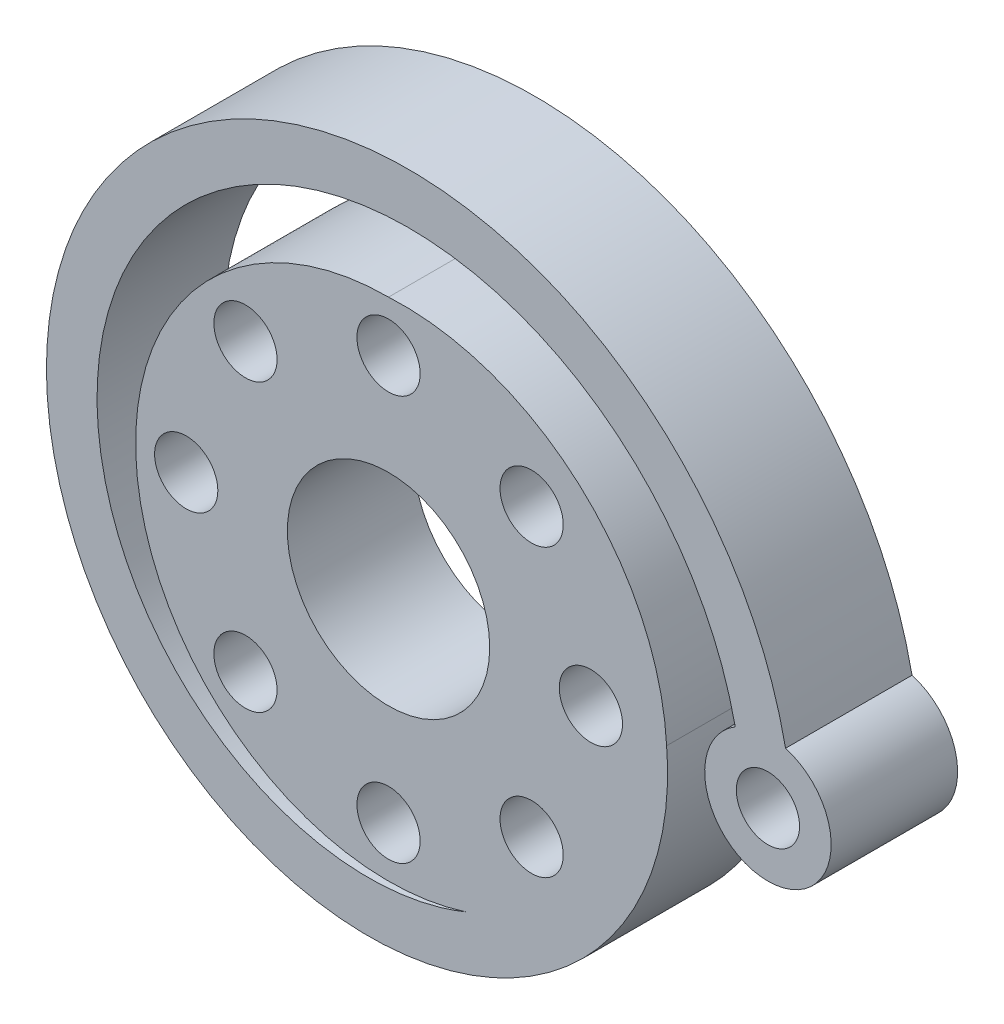
ISO-10303-21;
HEADER;
FILE_DESCRIPTION(('STEP AP214'),'2;1');
FILE_NAME('part.step','',(''),(''),'','','');
FILE_SCHEMA(('AUTOMOTIVE_DESIGN { 1 0 10303 214 1 1 1 1 }'));
ENDSEC;
DATA;
#1=APPLICATION_CONTEXT('core data for automotive mechanical design processes');
#2=APPLICATION_PROTOCOL_DEFINITION('international standard','automotive_design',2000,#1);
#3=PRODUCT_CONTEXT('',#1,'mechanical');
#4=PRODUCT('Part','Part','',(#3));
#5=PRODUCT_RELATED_PRODUCT_CATEGORY('part','',(#4));
#6=PRODUCT_DEFINITION_FORMATION('','',#4);
#7=PRODUCT_DEFINITION_CONTEXT('part definition',#1,'design');
#8=PRODUCT_DEFINITION('design','',#6,#7);
#9=PRODUCT_DEFINITION_SHAPE('','',#8);
#10=(LENGTH_UNIT() NAMED_UNIT(*) SI_UNIT(.MILLI.,.METRE.));
#11=(NAMED_UNIT(*) PLANE_ANGLE_UNIT() SI_UNIT($,.RADIAN.));
#12=(NAMED_UNIT(*) SI_UNIT($,.STERADIAN.) SOLID_ANGLE_UNIT());
#13=UNCERTAINTY_MEASURE_WITH_UNIT(LENGTH_MEASURE(1.E-05),#10,'distance_accuracy_value','');
#14=(GEOMETRIC_REPRESENTATION_CONTEXT(3) GLOBAL_UNCERTAINTY_ASSIGNED_CONTEXT((#13)) GLOBAL_UNIT_ASSIGNED_CONTEXT((#10,
#11,#12)) REPRESENTATION_CONTEXT('',''));
#15=CARTESIAN_POINT('',(0.,0.,0.));
#16=DIRECTION('',(0.,0.,1.));
#17=DIRECTION('',(1.,0.,0.));
#18=AXIS2_PLACEMENT_3D('',#15,#16,#17);
#19=CARTESIAN_POINT('',(0.,0.,2.5));
#20=DIRECTION('',(0.,0.,1.));
#21=DIRECTION('',(1.,0.,0.));
#22=AXIS2_PLACEMENT_3D('',#19,#20,#21);
#23=PLANE('',#22);
#24=CARTESIAN_POINT('',(15.,0.,2.5));
#25=DIRECTION('',(0.,0.,1.));
#26=DIRECTION('',(1.,0.,0.));
#27=AXIS2_PLACEMENT_3D('',#24,#25,#26);
#28=CIRCLE('',#27,1.25);
#29=CARTESIAN_POINT('',(16.25,0.,2.5));
#30=VERTEX_POINT('',#29);
#31=EDGE_CURVE('E228',#30,#30,#28,.T.);
#32=ORIENTED_EDGE('',*,*,#31,.F.);
#33=EDGE_LOOP('',(#32));
#34=FACE_BOUND('',#33,.T.);
#35=CARTESIAN_POINT('',(14.0014042751306,-0.0529771485877786,2.5));
#36=CARTESIAN_POINT('',(13.9041730455411,1.78019652095135,2.5));
#37=CARTESIAN_POINT('',(13.4425655873807,3.57209419642495,2.5));
#38=CARTESIAN_POINT('',(11.8908774959252,6.80923704342206,2.5));
#39=CARTESIAN_POINT('',(10.801709203525,8.25333290406653,2.5));
#40=CARTESIAN_POINT('',(8.18696613893286,10.5921890907236,2.5));
#41=CARTESIAN_POINT('',(6.66265131611176,11.4862596842162,2.5));
#42=CARTESIAN_POINT('',(3.42736791975972,12.614868216527,2.5));
#43=CARTESIAN_POINT('',(1.71779764208779,12.8492635131975,2.5));
#44=CARTESIAN_POINT('',(-1.62130253349248,12.6535629323774,2.5));
#45=CARTESIAN_POINT('',(-3.24951817725595,12.2238704914102,2.5));
#46=CARTESIAN_POINT('',(-6.18385048064188,10.7962704189784,2.5));
#47=CARTESIAN_POINT('',(-7.48893709981214,9.79922624606061,2.5));
#48=CARTESIAN_POINT('',(-9.5955192522989,7.41500614093897,2.5));
#49=CARTESIAN_POINT('',(-10.3964164266881,6.02899943999595,2.5));
#50=CARTESIAN_POINT('',(-11.3986490506443,3.09557891247944,2.5));
#51=CARTESIAN_POINT('',(-11.5998915588236,1.54944460153061,2.5));
#52=CARTESIAN_POINT('',(-11.4029527820651,-1.46240868151555,2.5));
#53=CARTESIAN_POINT('',(-11.0051753946417,-2.92694215777486,2.5));
#54=CARTESIAN_POINT('',(-9.70166334282952,-5.5584639181738,2.5));
#55=CARTESIAN_POINT('',(-8.79674328792216,-6.72454129491613,2.5));
#56=CARTESIAN_POINT('',(-6.64304614361916,-8.59884941451587,2.5));
#57=CARTESIAN_POINT('',(-5.39534756347179,-9.30657316823967,2.5));
#58=CARTESIAN_POINT('',(-2.76378990560753,-10.1824298856819,2.5));
#59=CARTESIAN_POINT('',(-1.38109156094889,-10.350519603358,2.5));
#60=CARTESIAN_POINT('',(1.30351482951407,-10.1523426328444,2.5));
#61=CARTESIAN_POINT('',(2.60436613786412,-9.78648029675871,2.5));
#62=CARTESIAN_POINT('',(4.93307735613537,-8.60705626779512,2.5));
#63=CARTESIAN_POINT('',(5.96014548912132,-7.79426032885127,2.5));
#64=CARTESIAN_POINT('',(7.60217957763164,-5.87108614723178,2.5));
#65=CARTESIAN_POINT('',(8.21672990849835,-4.76169568638045,2.5));
#66=CARTESIAN_POINT('',(8.96621072201242,-2.43200089930278,2.5));
#67=CARTESIAN_POINT('',(9.10114770430962,-1.21273865857678,2.5));
#68=CARTESIAN_POINT('',(9.00144006575811,-0.0340587714272848,2.5));
#69=B_SPLINE_CURVE_WITH_KNOTS('',3,(#35,#36,#37,#38,#39,#40,#41,#42,#43,#44,#45,#46,#47,#48,#49,
#50,#51,#52,#53,#54,#55,#56,#57,#58,#59,#60,#61,#62,#63,#64,#65,#66,#67,#68),.UNSPECIFIED.,.F.,
.F.,(4,2,2,2,2,2,2,2,2,2,2,2,2,2,2,2,4),(0.,0.0625,0.125,0.1875,0.25,0.3125,0.375,0.4375,0.5,
0.5625,0.625,0.6875,0.75,0.8125,0.875,0.9375,1.),.UNSPECIFIED.);
#70=CARTESIAN_POINT('',(13.7083307005809,2.14046500110098,2.5));
#71=VERTEX_POINT('',#70);
#72=CARTESIAN_POINT('',(3.06907607613109,-9.517393132519,2.5));
#73=VERTEX_POINT('',#72);
#74=EDGE_CURVE('E71',#71,#73,#69,.T.);
#75=ORIENTED_EDGE('',*,*,#74,.F.);
#76=CARTESIAN_POINT('',(15.,0.,2.5));
#77=DIRECTION('',(0.,0.,1.));
#78=DIRECTION('',(1.,0.,0.));
#79=AXIS2_PLACEMENT_3D('',#76,#77,#78);
#80=CIRCLE('',#79,2.5);
#81=CARTESIAN_POINT('',(15.6976438073508,2.40068596823183,2.5));
#82=VERTEX_POINT('',#81);
#83=EDGE_CURVE('E64',#71,#82,#80,.T.);
#84=ORIENTED_EDGE('',*,*,#83,.T.);
#85=CARTESIAN_POINT('',(15.9985957248694,0.052977148587828,2.5));
#86=CARTESIAN_POINT('',(15.8872795501964,2.15164577327234,2.5));
#87=CARTESIAN_POINT('',(15.3610577096306,4.19671994920044,2.5));
#88=CARTESIAN_POINT('',(13.5793871338556,7.91363942866431,2.5));
#89=CARTESIAN_POINT('',(12.3333869128871,9.56663243320485,2.5));
#90=CARTESIAN_POINT('',(9.32202057179803,12.2602549671691,2.5));
#91=CARTESIAN_POINT('',(7.57265019351631,13.2870147663856,2.5));
#92=CARTESIAN_POINT('',(3.83483527626342,14.5909216710075,2.5));
#93=CARTESIAN_POINT('',(1.86646514514663,14.8614119134394,2.5));
#94=CARTESIAN_POINT('',(-2.00405065799473,14.6345594409342,2.5));
#95=CARTESIAN_POINT('',(-3.88512620892426,14.1387788543309,2.5));
#96=CARTESIAN_POINT('',(-7.29823406274256,12.4782397787135,2.5));
#97=CARTESIAN_POINT('',(-8.8114313183162,11.323008141742,2.5));
#98=CARTESIAN_POINT('',(-11.2706240664472,8.53969550986318,2.5));
#99=CARTESIAN_POINT('',(-12.2029033800138,6.92763183497477,2.5));
#100=CARTESIAN_POINT('',(-13.3773491064331,3.49014383656333,2.5));
#101=CARTESIAN_POINT('',(-13.6130137120741,1.68476010171338,2.5));
#102=CARTESIAN_POINT('',(-13.3813037150699,-1.85876556098375,2.5));
#103=CARTESIAN_POINT('',(-12.9156285561767,-3.57592492524249,2.5));
#104=CARTESIAN_POINT('',(-11.3755466686018,-6.6850182372683,2.5));
#105=CARTESIAN_POINT('',(-10.3107684457435,-8.0582503885545,2.5));
#106=CARTESIAN_POINT('',(-7.75491900856079,-10.2825331647163,2.5));
#107=CARTESIAN_POINT('',(-6.27991650335728,-11.1200328214363,2.5));
#108=CARTESIAN_POINT('',(-3.14236181491027,-12.1642930376117,2.5));
#109=CARTESIAN_POINT('',(-1.49984174420885,-12.3647308063335,2.5));
#110=CARTESIAN_POINT('',(1.71678985434425,-12.1272735829763,2.5));
#111=CARTESIAN_POINT('',(3.26999052351833,-11.6912499946518,2.5));
#112=CARTESIAN_POINT('',(6.07479785871208,-10.270690198275,2.5));
#113=CARTESIAN_POINT('',(7.30783409733802,-9.29592584205075,2.5));
#114=CARTESIAN_POINT('',(9.29654529946515,-6.96670872991668,2.5));
#115=CARTESIAN_POINT('',(10.0388497389945,-5.62841931926862,2.5));
#116=CARTESIAN_POINT('',(10.9519098154886,-2.79023238487328,2.5));
#117=CARTESIAN_POINT('',(11.1165708577058,-1.31058210646893,2.5));
#118=CARTESIAN_POINT('',(10.9943203434189,0.134547868153647,2.5));
#119=B_SPLINE_CURVE_WITH_KNOTS('',3,(#85,#86,#87,#88,#89,#90,#91,#92,#93,#94,#95,#96,#97,#98,
#99,#100,#101,#102,#103,#104,#105,#106,#107,#108,#109,#110,#111,#112,#113,#114,#115,#116,#117,
#118),.UNSPECIFIED.,.F.,.F.,(4,2,2,2,2,2,2,2,2,2,2,2,2,2,2,2,4),(0.,0.0625,0.125,0.1875,0.25,
0.3125,0.375,0.4375,0.5,0.5625,0.625,0.6875,0.75,0.8125,0.875,0.9375,1.),.UNSPECIFIED.);
#120=CARTESIAN_POINT('',(10.9943203434189,0.134547868153647,2.5));
#121=VERTEX_POINT('',#120);
#122=EDGE_CURVE('E111',#82,#121,#119,.T.);
#123=ORIENTED_EDGE('',*,*,#122,.T.);
#124=CARTESIAN_POINT('',(0.564434105786274,-0.429886237632589,2.5));
#125=DIRECTION('',(0.,0.,1.));
#126=DIRECTION('',(1.,0.,0.));
#127=AXIS2_PLACEMENT_3D('',#124,#125,#126);
#128=CIRCLE('',#127,10.445147810813);
#129=CARTESIAN_POINT('',(0.,10.,2.5));
#130=VERTEX_POINT('',#129);
#131=EDGE_CURVE('E117',#130,#121,#128,.F.);
#132=ORIENTED_EDGE('',*,*,#131,.F.);
#133=CARTESIAN_POINT('',(0.,0.,2.5));
#134=DIRECTION('',(0.,0.,1.));
#135=DIRECTION('',(1.,0.,0.));
#136=AXIS2_PLACEMENT_3D('',#133,#134,#135);
#137=CIRCLE('',#136,10.);
#138=EDGE_CURVE('E109',#130,#73,#137,.T.);
#139=ORIENTED_EDGE('',*,*,#138,.T.);
#140=EDGE_LOOP('',(#75,#84,#123,#132,#139));
#141=FACE_BOUND('',#140,.T.);
#142=CARTESIAN_POINT('',(5.65685424949245,5.65685424949231,2.5));
#143=DIRECTION('',(0.,0.,1.));
#144=DIRECTION('',(1.,0.,0.));
#145=AXIS2_PLACEMENT_3D('',#142,#143,#144);
#146=CIRCLE('',#145,1.25);
#147=CARTESIAN_POINT('',(6.90685424949245,5.65685424949231,2.5));
#148=VERTEX_POINT('',#147);
#149=EDGE_CURVE('E104',#148,#148,#146,.T.);
#150=ORIENTED_EDGE('',*,*,#149,.F.);
#151=EDGE_LOOP('',(#150));
#152=FACE_BOUND('',#151,.T.);
#153=CARTESIAN_POINT('',(0.,8.,2.5));
#154=DIRECTION('',(0.,0.,1.));
#155=DIRECTION('',(1.,0.,0.));
#156=AXIS2_PLACEMENT_3D('',#153,#154,#155);
#157=CIRCLE('',#156,1.25);
#158=CARTESIAN_POINT('',(1.25000000000008,8.,2.5));
#159=VERTEX_POINT('',#158);
#160=EDGE_CURVE('E210',#159,#159,#157,.T.);
#161=ORIENTED_EDGE('',*,*,#160,.F.);
#162=EDGE_LOOP('',(#161));
#163=FACE_BOUND('',#162,.T.);
#164=CARTESIAN_POINT('',(-5.65685424949233,5.65685424949243,2.5));
#165=DIRECTION('',(0.,0.,1.));
#166=DIRECTION('',(1.,0.,0.));
#167=AXIS2_PLACEMENT_3D('',#164,#165,#166);
#168=CIRCLE('',#167,1.25);
#169=CARTESIAN_POINT('',(-4.40685424949233,5.65685424949243,2.5));
#170=VERTEX_POINT('',#169);
#171=EDGE_CURVE('E213',#170,#170,#168,.T.);
#172=ORIENTED_EDGE('',*,*,#171,.F.);
#173=EDGE_LOOP('',(#172));
#174=FACE_BOUND('',#173,.T.);
#175=CARTESIAN_POINT('',(-8.,0.,2.5));
#176=DIRECTION('',(0.,0.,1.));
#177=DIRECTION('',(1.,0.,0.));
#178=AXIS2_PLACEMENT_3D('',#175,#176,#177);
#179=CIRCLE('',#178,1.25);
#180=CARTESIAN_POINT('',(-6.75,0.,2.5));
#181=VERTEX_POINT('',#180);
#182=EDGE_CURVE('E216',#181,#181,#179,.T.);
#183=ORIENTED_EDGE('',*,*,#182,.F.);
#184=EDGE_LOOP('',(#183));
#185=FACE_BOUND('',#184,.T.);
#186=CARTESIAN_POINT('',(-5.65685424949241,-5.65685424949235,2.5));
#187=DIRECTION('',(0.,0.,1.));
#188=DIRECTION('',(1.,0.,0.));
#189=AXIS2_PLACEMENT_3D('',#186,#187,#188);
#190=CIRCLE('',#189,1.25);
#191=CARTESIAN_POINT('',(-4.40685424949241,-5.65685424949235,2.5));
#192=VERTEX_POINT('',#191);
#193=EDGE_CURVE('E219',#192,#192,#190,.T.);
#194=ORIENTED_EDGE('',*,*,#193,.F.);
#195=EDGE_LOOP('',(#194));
#196=FACE_BOUND('',#195,.T.);
#197=CARTESIAN_POINT('',(0.,-8.,2.5));
#198=DIRECTION('',(0.,0.,1.));
#199=DIRECTION('',(1.,0.,0.));
#200=AXIS2_PLACEMENT_3D('',#197,#198,#199);
#201=CIRCLE('',#200,1.25);
#202=CARTESIAN_POINT('',(1.24999999999997,-8.,2.5));
#203=VERTEX_POINT('',#202);
#204=EDGE_CURVE('E222',#203,#203,#201,.T.);
#205=ORIENTED_EDGE('',*,*,#204,.F.);
#206=EDGE_LOOP('',(#205));
#207=FACE_BOUND('',#206,.T.);
#208=CARTESIAN_POINT('',(5.65685424949237,-5.65685424949239,2.5));
#209=DIRECTION('',(0.,0.,1.));
#210=DIRECTION('',(1.,0.,0.));
#211=AXIS2_PLACEMENT_3D('',#208,#209,#210);
#212=CIRCLE('',#211,1.25);
#213=CARTESIAN_POINT('',(6.90685424949237,-5.65685424949239,2.5));
#214=VERTEX_POINT('',#213);
#215=EDGE_CURVE('E207',#214,#214,#212,.T.);
#216=ORIENTED_EDGE('',*,*,#215,.F.);
#217=EDGE_LOOP('',(#216));
#218=FACE_BOUND('',#217,.T.);
#219=CARTESIAN_POINT('',(8.,0.,2.5));
#220=DIRECTION('',(0.,0.,1.));
#221=DIRECTION('',(1.,0.,0.));
#222=AXIS2_PLACEMENT_3D('',#219,#220,#221);
#223=CIRCLE('',#222,1.25);
#224=CARTESIAN_POINT('',(9.25,0.,2.5));
#225=VERTEX_POINT('',#224);
#226=EDGE_CURVE('E174',#225,#225,#223,.T.);
#227=ORIENTED_EDGE('',*,*,#226,.F.);
#228=EDGE_LOOP('',(#227));
#229=FACE_BOUND('',#228,.T.);
#230=CARTESIAN_POINT('',(0.,0.,2.5));
#231=DIRECTION('',(0.,0.,1.));
#232=DIRECTION('',(1.,0.,0.));
#233=AXIS2_PLACEMENT_3D('',#230,#231,#232);
#234=CIRCLE('',#233,4.);
#235=CARTESIAN_POINT('',(4.,0.,2.5));
#236=VERTEX_POINT('',#235);
#237=EDGE_CURVE('E183',#236,#236,#234,.T.);
#238=ORIENTED_EDGE('',*,*,#237,.F.);
#239=EDGE_LOOP('',(#238));
#240=FACE_BOUND('',#239,.T.);
#241=ADVANCED_FACE('F47',(#34,#141,#152,#163,#174,#185,#196,#207,#218,#229,#240),#23,.T.);
#242=CARTESIAN_POINT('',(0.,0.,-2.5));
#243=DIRECTION('',(0.,0.,1.));
#244=DIRECTION('',(1.,0.,0.));
#245=AXIS2_PLACEMENT_3D('',#242,#243,#244);
#246=PLANE('',#245);
#247=CARTESIAN_POINT('',(15.,0.,-2.5));
#248=DIRECTION('',(0.,0.,1.));
#249=DIRECTION('',(1.,0.,0.));
#250=AXIS2_PLACEMENT_3D('',#247,#248,#249);
#251=CIRCLE('',#250,1.25);
#252=CARTESIAN_POINT('',(16.25,0.,-2.5));
#253=VERTEX_POINT('',#252);
#254=EDGE_CURVE('E51',#253,#253,#251,.T.);
#255=ORIENTED_EDGE('',*,*,#254,.T.);
#256=EDGE_LOOP('',(#255));
#257=FACE_BOUND('',#256,.T.);
#258=CARTESIAN_POINT('',(5.65685424949245,5.65685424949231,-2.5));
#259=DIRECTION('',(0.,0.,1.));
#260=DIRECTION('',(1.,0.,0.));
#261=AXIS2_PLACEMENT_3D('',#258,#259,#260);
#262=CIRCLE('',#261,1.25);
#263=CARTESIAN_POINT('',(6.90685424949245,5.65685424949231,-2.5));
#264=VERTEX_POINT('',#263);
#265=EDGE_CURVE('E149',#264,#264,#262,.T.);
#266=ORIENTED_EDGE('',*,*,#265,.T.);
#267=EDGE_LOOP('',(#266));
#268=FACE_BOUND('',#267,.T.);
#269=CARTESIAN_POINT('',(0.,8.,-2.5));
#270=DIRECTION('',(0.,0.,1.));
#271=DIRECTION('',(1.,0.,0.));
#272=AXIS2_PLACEMENT_3D('',#269,#270,#271);
#273=CIRCLE('',#272,1.25);
#274=CARTESIAN_POINT('',(1.25000000000008,8.,-2.5));
#275=VERTEX_POINT('',#274);
#276=EDGE_CURVE('E153',#275,#275,#273,.T.);
#277=ORIENTED_EDGE('',*,*,#276,.T.);
#278=EDGE_LOOP('',(#277));
#279=FACE_BOUND('',#278,.T.);
#280=CARTESIAN_POINT('',(-5.65685424949233,5.65685424949243,-2.5));
#281=DIRECTION('',(0.,0.,1.));
#282=DIRECTION('',(1.,0.,0.));
#283=AXIS2_PLACEMENT_3D('',#280,#281,#282);
#284=CIRCLE('',#283,1.25);
#285=CARTESIAN_POINT('',(-4.40685424949233,5.65685424949243,-2.5));
#286=VERTEX_POINT('',#285);
#287=EDGE_CURVE('E156',#286,#286,#284,.T.);
#288=ORIENTED_EDGE('',*,*,#287,.T.);
#289=EDGE_LOOP('',(#288));
#290=FACE_BOUND('',#289,.T.);
#291=CARTESIAN_POINT('',(-8.,0.,-2.5));
#292=DIRECTION('',(0.,0.,1.));
#293=DIRECTION('',(1.,0.,0.));
#294=AXIS2_PLACEMENT_3D('',#291,#292,#293);
#295=CIRCLE('',#294,1.25);
#296=CARTESIAN_POINT('',(-6.75,0.,-2.5));
#297=VERTEX_POINT('',#296);
#298=EDGE_CURVE('E159',#297,#297,#295,.T.);
#299=ORIENTED_EDGE('',*,*,#298,.T.);
#300=EDGE_LOOP('',(#299));
#301=FACE_BOUND('',#300,.T.);
#302=CARTESIAN_POINT('',(-5.65685424949241,-5.65685424949235,-2.5));
#303=DIRECTION('',(0.,0.,1.));
#304=DIRECTION('',(1.,0.,0.));
#305=AXIS2_PLACEMENT_3D('',#302,#303,#304);
#306=CIRCLE('',#305,1.25);
#307=CARTESIAN_POINT('',(-4.40685424949241,-5.65685424949235,-2.5));
#308=VERTEX_POINT('',#307);
#309=EDGE_CURVE('E162',#308,#308,#306,.T.);
#310=ORIENTED_EDGE('',*,*,#309,.T.);
#311=EDGE_LOOP('',(#310));
#312=FACE_BOUND('',#311,.T.);
#313=CARTESIAN_POINT('',(0.,-8.,-2.5));
#314=DIRECTION('',(0.,0.,1.));
#315=DIRECTION('',(1.,0.,0.));
#316=AXIS2_PLACEMENT_3D('',#313,#314,#315);
#317=CIRCLE('',#316,1.25);
#318=CARTESIAN_POINT('',(1.24999999999997,-8.,-2.5));
#319=VERTEX_POINT('',#318);
#320=EDGE_CURVE('E165',#319,#319,#317,.T.);
#321=ORIENTED_EDGE('',*,*,#320,.T.);
#322=EDGE_LOOP('',(#321));
#323=FACE_BOUND('',#322,.T.);
#324=CARTESIAN_POINT('',(5.65685424949237,-5.65685424949239,-2.5));
#325=DIRECTION('',(0.,0.,1.));
#326=DIRECTION('',(1.,0.,0.));
#327=AXIS2_PLACEMENT_3D('',#324,#325,#326);
#328=CIRCLE('',#327,1.25);
#329=CARTESIAN_POINT('',(6.90685424949237,-5.65685424949239,-2.5));
#330=VERTEX_POINT('',#329);
#331=EDGE_CURVE('E168',#330,#330,#328,.T.);
#332=ORIENTED_EDGE('',*,*,#331,.T.);
#333=EDGE_LOOP('',(#332));
#334=FACE_BOUND('',#333,.T.);
#335=CARTESIAN_POINT('',(8.,0.,-2.5));
#336=DIRECTION('',(0.,0.,1.));
#337=DIRECTION('',(1.,0.,0.));
#338=AXIS2_PLACEMENT_3D('',#335,#336,#337);
#339=CIRCLE('',#338,1.25);
#340=CARTESIAN_POINT('',(9.25,0.,-2.5));
#341=VERTEX_POINT('',#340);
#342=EDGE_CURVE('E171',#341,#341,#339,.T.);
#343=ORIENTED_EDGE('',*,*,#342,.T.);
#344=EDGE_LOOP('',(#343));
#345=FACE_BOUND('',#344,.T.);
#346=CARTESIAN_POINT('',(15.9985957248694,0.0529771485878281,-2.5));
#347=CARTESIAN_POINT('',(15.8872795501964,2.15164577327234,-2.5));
#348=CARTESIAN_POINT('',(15.3610577096306,4.19671994920044,-2.5));
#349=CARTESIAN_POINT('',(13.5793871338556,7.91363942866431,-2.5));
#350=CARTESIAN_POINT('',(12.3333869128871,9.56663243320485,-2.5));
#351=CARTESIAN_POINT('',(9.32202057179803,12.2602549671691,-2.5));
#352=CARTESIAN_POINT('',(7.57265019351631,13.2870147663856,-2.5));
#353=CARTESIAN_POINT('',(3.83483527626342,14.5909216710075,-2.5));
#354=CARTESIAN_POINT('',(1.86646514514665,14.8614119134394,-2.5));
#355=CARTESIAN_POINT('',(-2.00405065799475,14.6345594409342,-2.5));
#356=CARTESIAN_POINT('',(-3.88512620892496,14.1387788543309,-2.5));
#357=CARTESIAN_POINT('',(-7.29823406274185,12.4782397787135,-2.5));
#358=CARTESIAN_POINT('',(-8.8114313183162,11.323008141742,-2.5));
#359=CARTESIAN_POINT('',(-11.2706240664472,8.53969550986318,-2.5));
#360=CARTESIAN_POINT('',(-12.2029033800138,6.92763183497477,-2.5));
#361=CARTESIAN_POINT('',(-13.3773491064331,3.49014383656333,-2.5));
#362=CARTESIAN_POINT('',(-13.6130137120741,1.68476010171338,-2.5));
#363=CARTESIAN_POINT('',(-13.3813037150699,-1.85876556098375,-2.5));
#364=CARTESIAN_POINT('',(-12.9156285561767,-3.57592492524249,-2.5));
#365=CARTESIAN_POINT('',(-11.3755466686018,-6.6850182372683,-2.5));
#366=CARTESIAN_POINT('',(-10.3107684457435,-8.0582503885545,-2.5));
#367=CARTESIAN_POINT('',(-7.75491900856079,-10.2825331647163,-2.5));
#368=CARTESIAN_POINT('',(-6.27991650335728,-11.1200328214363,-2.5));
#369=CARTESIAN_POINT('',(-3.14236181491027,-12.1642930376117,-2.5));
#370=CARTESIAN_POINT('',(-1.49984174420885,-12.3647308063335,-2.5));
#371=CARTESIAN_POINT('',(1.71678985434425,-12.1272735829763,-2.5));
#372=CARTESIAN_POINT('',(3.26999052351833,-11.6912499946518,-2.5));
#373=CARTESIAN_POINT('',(6.07479785871208,-10.270690198275,-2.5));
#374=CARTESIAN_POINT('',(7.30783409733802,-9.29592584205075,-2.5));
#375=CARTESIAN_POINT('',(9.29654529946515,-6.96670872991668,-2.5));
#376=CARTESIAN_POINT('',(10.0388497389945,-5.62841931926862,-2.5));
#377=CARTESIAN_POINT('',(10.9519098154886,-2.79023238487328,-2.5));
#378=CARTESIAN_POINT('',(11.1165708577058,-1.31058210646899,-2.5));
#379=CARTESIAN_POINT('',(10.9943203434189,0.134547868153647,-2.5));
#380=B_SPLINE_CURVE_WITH_KNOTS('',3,(#346,#347,#348,#349,#350,#351,#352,#353,#354,#355,#356,
#357,#358,#359,#360,#361,#362,#363,#364,#365,#366,#367,#368,#369,#370,#371,#372,#373,#374,#375,
#376,#377,#378,#379),.UNSPECIFIED.,.F.,.F.,(4,2,2,2,2,2,2,2,2,2,2,2,2,2,2,2,4),(0.,0.0625,0.125,
0.1875,0.25,0.3125,0.375,0.4375,0.5,0.5625,0.625,0.6875,0.75,0.8125,0.875,0.9375,1.),.UNSPECIFIED.);
#381=CARTESIAN_POINT('',(15.6976438073508,2.40068596823183,-2.5));
#382=VERTEX_POINT('',#381);
#383=CARTESIAN_POINT('',(10.9943203434189,0.134547868153647,-2.5));
#384=VERTEX_POINT('',#383);
#385=EDGE_CURVE('E147',#382,#384,#380,.T.);
#386=ORIENTED_EDGE('',*,*,#385,.F.);
#387=CARTESIAN_POINT('',(15.,0.,-2.5));
#388=DIRECTION('',(0.,0.,1.));
#389=DIRECTION('',(1.,0.,0.));
#390=AXIS2_PLACEMENT_3D('',#387,#388,#389);
#391=CIRCLE('',#390,2.5);
#392=CARTESIAN_POINT('',(13.7083307005809,2.14046500110098,-2.5));
#393=VERTEX_POINT('',#392);
#394=EDGE_CURVE('E99',#393,#382,#391,.T.);
#395=ORIENTED_EDGE('',*,*,#394,.F.);
#396=CARTESIAN_POINT('',(14.0014042751306,-0.0529771485877786,-2.5));
#397=CARTESIAN_POINT('',(13.9041730455411,1.78019652095135,-2.5));
#398=CARTESIAN_POINT('',(13.4425655873807,3.57209419642495,-2.5));
#399=CARTESIAN_POINT('',(11.8908774959252,6.80923704342206,-2.5));
#400=CARTESIAN_POINT('',(10.801709203525,8.25333290406653,-2.5));
#401=CARTESIAN_POINT('',(8.18696613893286,10.5921890907236,-2.5));
#402=CARTESIAN_POINT('',(6.66265131611176,11.4862596842162,-2.5));
#403=CARTESIAN_POINT('',(3.42736791975972,12.614868216527,-2.5));
#404=CARTESIAN_POINT('',(1.71779764208779,12.8492635131975,-2.5));
#405=CARTESIAN_POINT('',(-1.62130253349248,12.6535629323774,-2.5));
#406=CARTESIAN_POINT('',(-3.24951817725595,12.2238704914102,-2.5));
#407=CARTESIAN_POINT('',(-6.18385048064188,10.7962704189784,-2.5));
#408=CARTESIAN_POINT('',(-7.48893709981214,9.79922624606061,-2.5));
#409=CARTESIAN_POINT('',(-9.5955192522989,7.41500614093897,-2.5));
#410=CARTESIAN_POINT('',(-10.3964164266881,6.02899943999595,-2.5));
#411=CARTESIAN_POINT('',(-11.3986490506443,3.09557891247944,-2.5));
#412=CARTESIAN_POINT('',(-11.5998915588236,1.54944460153062,-2.5));
#413=CARTESIAN_POINT('',(-11.4029527820651,-1.46240868151556,-2.5));
#414=CARTESIAN_POINT('',(-11.0051753946417,-2.92694215777486,-2.5));
#415=CARTESIAN_POINT('',(-9.70166334282952,-5.5584639181738,-2.5));
#416=CARTESIAN_POINT('',(-8.79674328792216,-6.72454129491613,-2.5));
#417=CARTESIAN_POINT('',(-6.64304614361916,-8.59884941451587,-2.5));
#418=CARTESIAN_POINT('',(-5.39534756347179,-9.30657316823967,-2.5));
#419=CARTESIAN_POINT('',(-2.76378990560753,-10.1824298856819,-2.5));
#420=CARTESIAN_POINT('',(-1.38109156094889,-10.350519603358,-2.5));
#421=CARTESIAN_POINT('',(1.30351482951407,-10.1523426328444,-2.5));
#422=CARTESIAN_POINT('',(2.60436613786412,-9.78648029675871,-2.5));
#423=CARTESIAN_POINT('',(4.93307735613537,-8.60705626779512,-2.5));
#424=CARTESIAN_POINT('',(5.96014548912132,-7.79426032885127,-2.5));
#425=CARTESIAN_POINT('',(7.60217957763164,-5.87108614723178,-2.5));
#426=CARTESIAN_POINT('',(8.21672990849835,-4.76169568638045,-2.5));
#427=CARTESIAN_POINT('',(8.96621072201242,-2.43200089930278,-2.5));
#428=CARTESIAN_POINT('',(9.10114770430962,-1.21273865857678,-2.5));
#429=CARTESIAN_POINT('',(9.00144006575811,-0.0340587714272848,-2.5));
#430=B_SPLINE_CURVE_WITH_KNOTS('',3,(#396,#397,#398,#399,#400,#401,#402,#403,#404,#405,#406,
#407,#408,#409,#410,#411,#412,#413,#414,#415,#416,#417,#418,#419,#420,#421,#422,#423,#424,#425,
#426,#427,#428,#429),.UNSPECIFIED.,.F.,.F.,(4,2,2,2,2,2,2,2,2,2,2,2,2,2,2,2,4),(0.,0.0625,0.125,
0.1875,0.25,0.3125,0.375,0.4375,0.5,0.5625,0.625,0.6875,0.75,0.8125,0.875,0.9375,1.),.UNSPECIFIED.);
#431=CARTESIAN_POINT('',(3.06907607613107,-9.517393132519,-2.5));
#432=VERTEX_POINT('',#431);
#433=EDGE_CURVE('E103',#393,#432,#430,.T.);
#434=ORIENTED_EDGE('',*,*,#433,.T.);
#435=CARTESIAN_POINT('',(0.,0.,-2.5));
#436=DIRECTION('',(0.,0.,1.));
#437=DIRECTION('',(1.,0.,0.));
#438=AXIS2_PLACEMENT_3D('',#435,#436,#437);
#439=CIRCLE('',#438,10.);
#440=CARTESIAN_POINT('',(0.,10.,-2.5));
#441=VERTEX_POINT('',#440);
#442=EDGE_CURVE('E180',#441,#432,#439,.T.);
#443=ORIENTED_EDGE('',*,*,#442,.F.);
#444=CARTESIAN_POINT('',(0.564434105786274,-0.429886237632589,-2.5));
#445=DIRECTION('',(0.,0.,1.));
#446=DIRECTION('',(1.,0.,0.));
#447=AXIS2_PLACEMENT_3D('',#444,#445,#446);
#448=CIRCLE('',#447,10.445147810813);
#449=EDGE_CURVE('E152',#441,#384,#448,.F.);
#450=ORIENTED_EDGE('',*,*,#449,.T.);
#451=EDGE_LOOP('',(#386,#395,#434,#443,#450));
#452=FACE_BOUND('',#451,.T.);
#453=CARTESIAN_POINT('',(0.,0.,-2.5));
#454=DIRECTION('',(0.,0.,1.));
#455=DIRECTION('',(1.,0.,0.));
#456=AXIS2_PLACEMENT_3D('',#453,#454,#455);
#457=CIRCLE('',#456,4.);
#458=CARTESIAN_POINT('',(4.,0.,-2.5));
#459=VERTEX_POINT('',#458);
#460=EDGE_CURVE('E185',#459,#459,#457,.T.);
#461=ORIENTED_EDGE('',*,*,#460,.T.);
#462=EDGE_LOOP('',(#461));
#463=FACE_BOUND('',#462,.T.);
#464=ADVANCED_FACE('F201',(#257,#268,#279,#290,#301,#312,#323,#334,#345,#452,#463),#246,.F.);
#465=CARTESIAN_POINT('',(0.,0.,2.5));
#466=DIRECTION('',(0.,0.,-1.));
#467=DIRECTION('',(-1.,0.,0.));
#468=AXIS2_PLACEMENT_3D('',#465,#466,#467);
#469=CYLINDRICAL_SURFACE('',#468,10.);
#470=ORIENTED_EDGE('',*,*,#138,.F.);
#471=DIRECTION('',(0.,0.,-1.));
#472=VECTOR('',#471,1.);
#473=CARTESIAN_POINT('',(0.,10.,2.5));
#474=LINE('',#473,#472);
#475=EDGE_CURVE('E112',#130,#441,#474,.T.);
#476=ORIENTED_EDGE('',*,*,#475,.T.);
#477=ORIENTED_EDGE('',*,*,#442,.T.);
#478=DIRECTION('',(0.,0.,-1.));
#479=VECTOR('',#478,1.);
#480=CARTESIAN_POINT('',(3.06907607613104,-9.51739313251901,0.));
#481=LINE('',#480,#479);
#482=EDGE_CURVE('E56',#73,#432,#481,.T.);
#483=ORIENTED_EDGE('',*,*,#482,.F.);
#484=EDGE_LOOP('',(#470,#476,#477,#483));
#485=FACE_BOUND('',#484,.T.);
#486=ADVANCED_FACE('F49',(#485),#469,.T.);
#487=CARTESIAN_POINT('',(0.,0.,2.5));
#488=DIRECTION('',(0.,0.,-1.));
#489=DIRECTION('',(-1.,0.,0.));
#490=AXIS2_PLACEMENT_3D('',#487,#488,#489);
#491=CYLINDRICAL_SURFACE('',#490,4.);
#492=ORIENTED_EDGE('',*,*,#237,.T.);
#493=EDGE_LOOP('',(#492));
#494=FACE_BOUND('',#493,.T.);
#495=ORIENTED_EDGE('',*,*,#460,.F.);
#496=EDGE_LOOP('',(#495));
#497=FACE_BOUND('',#496,.T.);
#498=ADVANCED_FACE('F252',(#494,#497),#491,.F.);
#499=CARTESIAN_POINT('',(14.0014042751306,-0.0529771485877786,2.5));
#500=CARTESIAN_POINT('',(13.9041730455411,1.78019652095135,2.5));
#501=CARTESIAN_POINT('',(13.4425655873807,3.57209419642495,2.5));
#502=CARTESIAN_POINT('',(11.8908774959252,6.80923704342206,2.5));
#503=CARTESIAN_POINT('',(10.801709203525,8.25333290406653,2.5));
#504=CARTESIAN_POINT('',(8.18696613893286,10.5921890907236,2.5));
#505=CARTESIAN_POINT('',(6.66265131611176,11.4862596842162,2.5));
#506=CARTESIAN_POINT('',(3.42736791975972,12.614868216527,2.5));
#507=CARTESIAN_POINT('',(1.71779764208779,12.8492635131975,2.5));
#508=CARTESIAN_POINT('',(-1.62130253349248,12.6535629323774,2.5));
#509=CARTESIAN_POINT('',(-3.24951817725595,12.2238704914102,2.5));
#510=CARTESIAN_POINT('',(-6.18385048064188,10.7962704189784,2.5));
#511=CARTESIAN_POINT('',(-7.48893709981214,9.79922624606061,2.5));
#512=CARTESIAN_POINT('',(-9.5955192522989,7.41500614093897,2.5));
#513=CARTESIAN_POINT('',(-10.3964164266881,6.02899943999595,2.5));
#514=CARTESIAN_POINT('',(-11.3986490506443,3.09557891247944,2.5));
#515=CARTESIAN_POINT('',(-11.5998915588236,1.54944460153061,2.5));
#516=CARTESIAN_POINT('',(-11.4029527820651,-1.46240868151555,2.5));
#517=CARTESIAN_POINT('',(-11.0051753946417,-2.92694215777486,2.5));
#518=CARTESIAN_POINT('',(-9.70166334282952,-5.5584639181738,2.5));
#519=CARTESIAN_POINT('',(-8.79674328792216,-6.72454129491613,2.5));
#520=CARTESIAN_POINT('',(-6.64304614361916,-8.59884941451587,2.5));
#521=CARTESIAN_POINT('',(-5.39534756347179,-9.30657316823967,2.5));
#522=CARTESIAN_POINT('',(-2.76378990560753,-10.1824298856819,2.5));
#523=CARTESIAN_POINT('',(-1.38109156094889,-10.350519603358,2.5));
#524=CARTESIAN_POINT('',(1.30351482951407,-10.1523426328444,2.5));
#525=CARTESIAN_POINT('',(2.60436613786412,-9.78648029675871,2.5));
#526=CARTESIAN_POINT('',(4.93307735613537,-8.60705626779512,2.5));
#527=CARTESIAN_POINT('',(5.96014548912132,-7.79426032885127,2.5));
#528=CARTESIAN_POINT('',(7.60217957763164,-5.87108614723178,2.5));
#529=CARTESIAN_POINT('',(8.21672990849835,-4.76169568638045,2.5));
#530=CARTESIAN_POINT('',(8.96621072201242,-2.43200089930278,2.5));
#531=CARTESIAN_POINT('',(9.10114770430962,-1.21273865857678,2.5));
#532=CARTESIAN_POINT('',(9.00144006575811,-0.0340587714272848,2.5));
#533=CARTESIAN_POINT('',(14.0014042751306,-0.0529771485877786,-2.5));
#534=CARTESIAN_POINT('',(13.9041730455411,1.78019652095135,-2.5));
#535=CARTESIAN_POINT('',(13.4425655873807,3.57209419642495,-2.5));
#536=CARTESIAN_POINT('',(11.8908774959252,6.80923704342206,-2.5));
#537=CARTESIAN_POINT('',(10.801709203525,8.25333290406653,-2.5));
#538=CARTESIAN_POINT('',(8.18696613893286,10.5921890907236,-2.5));
#539=CARTESIAN_POINT('',(6.66265131611176,11.4862596842162,-2.5));
#540=CARTESIAN_POINT('',(3.42736791975972,12.614868216527,-2.5));
#541=CARTESIAN_POINT('',(1.71779764208779,12.8492635131975,-2.5));
#542=CARTESIAN_POINT('',(-1.62130253349248,12.6535629323774,-2.5));
#543=CARTESIAN_POINT('',(-3.24951817725595,12.2238704914102,-2.5));
#544=CARTESIAN_POINT('',(-6.18385048064188,10.7962704189784,-2.5));
#545=CARTESIAN_POINT('',(-7.48893709981214,9.79922624606061,-2.5));
#546=CARTESIAN_POINT('',(-9.5955192522989,7.41500614093897,-2.5));
#547=CARTESIAN_POINT('',(-10.3964164266881,6.02899943999595,-2.5));
#548=CARTESIAN_POINT('',(-11.3986490506443,3.09557891247944,-2.5));
#549=CARTESIAN_POINT('',(-11.5998915588236,1.54944460153062,-2.5));
#550=CARTESIAN_POINT('',(-11.4029527820651,-1.46240868151556,-2.5));
#551=CARTESIAN_POINT('',(-11.0051753946417,-2.92694215777486,-2.5));
#552=CARTESIAN_POINT('',(-9.70166334282952,-5.5584639181738,-2.5));
#553=CARTESIAN_POINT('',(-8.79674328792216,-6.72454129491613,-2.5));
#554=CARTESIAN_POINT('',(-6.64304614361916,-8.59884941451587,-2.5));
#555=CARTESIAN_POINT('',(-5.39534756347179,-9.30657316823967,-2.5));
#556=CARTESIAN_POINT('',(-2.76378990560753,-10.1824298856819,-2.5));
#557=CARTESIAN_POINT('',(-1.38109156094889,-10.350519603358,-2.5));
#558=CARTESIAN_POINT('',(1.30351482951407,-10.1523426328444,-2.5));
#559=CARTESIAN_POINT('',(2.60436613786412,-9.78648029675871,-2.5));
#560=CARTESIAN_POINT('',(4.93307735613537,-8.60705626779512,-2.5));
#561=CARTESIAN_POINT('',(5.96014548912132,-7.79426032885127,-2.5));
#562=CARTESIAN_POINT('',(7.60217957763164,-5.87108614723178,-2.5));
#563=CARTESIAN_POINT('',(8.21672990849835,-4.76169568638045,-2.5));
#564=CARTESIAN_POINT('',(8.96621072201242,-2.43200089930278,-2.5));
#565=CARTESIAN_POINT('',(9.10114770430962,-1.21273865857678,-2.5));
#566=CARTESIAN_POINT('',(9.00144006575811,-0.0340587714272848,-2.5));
#567=B_SPLINE_SURFACE_WITH_KNOTS('',1,3,((#499,#500,#501,#502,#503,#504,#505,#506,#507,#508,
#509,#510,#511,#512,#513,#514,#515,#516,#517,#518,#519,#520,#521,#522,#523,#524,#525,#526,#527,
#528,#529,#530,#531,#532),(#533,#534,#535,#536,#537,#538,#539,#540,#541,#542,#543,#544,#545,
#546,#547,#548,#549,#550,#551,#552,#553,#554,#555,#556,#557,#558,#559,#560,#561,#562,#563,#564,
#565,#566)),.UNSPECIFIED.,.F.,.F.,.F.,(2,2),(4,2,2,2,2,2,2,2,2,2,2,2,2,2,2,2,4),(0.,
0.357142857142857),(0.,0.0625,0.125,0.1875,0.25,0.3125,0.375,0.4375,0.5,0.5625,0.625,0.6875,
0.75,0.8125,0.875,0.9375,1.),.UNSPECIFIED.);
#568=DIRECTION('',(0.,0.,-1.));
#569=VECTOR('',#568,1.);
#570=CARTESIAN_POINT('',(13.7083307005809,2.14046500110098,0.));
#571=LINE('',#570,#569);
#572=EDGE_CURVE('E96',#393,#71,#571,.F.);
#573=ORIENTED_EDGE('',*,*,#433,.F.);
#574=ORIENTED_EDGE('',*,*,#572,.T.);
#575=ORIENTED_EDGE('',*,*,#74,.T.);
#576=ORIENTED_EDGE('',*,*,#482,.T.);
#577=EDGE_LOOP('',(#573,#574,#575,#576));
#578=FACE_BOUND('',#577,.T.);
#579=ADVANCED_FACE('F102',(#578),#567,.F.);
#580=CARTESIAN_POINT('',(15.9985957248694,0.0529771485878281,-2.5));
#581=CARTESIAN_POINT('',(15.8872795501964,2.15164577327234,-2.5));
#582=CARTESIAN_POINT('',(15.3610577096306,4.19671994920044,-2.5));
#583=CARTESIAN_POINT('',(13.5793871338556,7.91363942866431,-2.5));
#584=CARTESIAN_POINT('',(12.3333869128871,9.56663243320485,-2.5));
#585=CARTESIAN_POINT('',(9.32202057179803,12.2602549671691,-2.5));
#586=CARTESIAN_POINT('',(7.57265019351631,13.2870147663856,-2.5));
#587=CARTESIAN_POINT('',(3.83483527626342,14.5909216710075,-2.5));
#588=CARTESIAN_POINT('',(1.86646514514665,14.8614119134394,-2.5));
#589=CARTESIAN_POINT('',(-2.00405065799475,14.6345594409342,-2.5));
#590=CARTESIAN_POINT('',(-3.88512620892496,14.1387788543309,-2.5));
#591=CARTESIAN_POINT('',(-7.29823406274185,12.4782397787135,-2.5));
#592=CARTESIAN_POINT('',(-8.8114313183162,11.323008141742,-2.5));
#593=CARTESIAN_POINT('',(-11.2706240664472,8.53969550986318,-2.5));
#594=CARTESIAN_POINT('',(-12.2029033800138,6.92763183497477,-2.5));
#595=CARTESIAN_POINT('',(-13.3773491064331,3.49014383656333,-2.5));
#596=CARTESIAN_POINT('',(-13.6130137120741,1.68476010171338,-2.5));
#597=CARTESIAN_POINT('',(-13.3813037150699,-1.85876556098375,-2.5));
#598=CARTESIAN_POINT('',(-12.9156285561767,-3.57592492524249,-2.5));
#599=CARTESIAN_POINT('',(-11.3755466686018,-6.6850182372683,-2.5));
#600=CARTESIAN_POINT('',(-10.3107684457435,-8.0582503885545,-2.5));
#601=CARTESIAN_POINT('',(-7.75491900856079,-10.2825331647163,-2.5));
#602=CARTESIAN_POINT('',(-6.27991650335728,-11.1200328214363,-2.5));
#603=CARTESIAN_POINT('',(-3.14236181491027,-12.1642930376117,-2.5));
#604=CARTESIAN_POINT('',(-1.49984174420885,-12.3647308063335,-2.5));
#605=CARTESIAN_POINT('',(1.71678985434425,-12.1272735829763,-2.5));
#606=CARTESIAN_POINT('',(3.26999052351833,-11.6912499946518,-2.5));
#607=CARTESIAN_POINT('',(6.07479785871208,-10.270690198275,-2.5));
#608=CARTESIAN_POINT('',(7.30783409733802,-9.29592584205075,-2.5));
#609=CARTESIAN_POINT('',(9.29654529946515,-6.96670872991668,-2.5));
#610=CARTESIAN_POINT('',(10.0388497389945,-5.62841931926862,-2.5));
#611=CARTESIAN_POINT('',(10.9519098154886,-2.79023238487328,-2.5));
#612=CARTESIAN_POINT('',(11.1165708577058,-1.31058210646899,-2.5));
#613=CARTESIAN_POINT('',(10.9943203434189,0.134547868153647,-2.5));
#614=CARTESIAN_POINT('',(15.9985957248694,0.052977148587828,2.5));
#615=CARTESIAN_POINT('',(15.8872795501964,2.15164577327234,2.5));
#616=CARTESIAN_POINT('',(15.3610577096306,4.19671994920044,2.5));
#617=CARTESIAN_POINT('',(13.5793871338556,7.91363942866431,2.5));
#618=CARTESIAN_POINT('',(12.3333869128871,9.56663243320485,2.5));
#619=CARTESIAN_POINT('',(9.32202057179803,12.2602549671691,2.5));
#620=CARTESIAN_POINT('',(7.57265019351631,13.2870147663856,2.5));
#621=CARTESIAN_POINT('',(3.83483527626342,14.5909216710075,2.5));
#622=CARTESIAN_POINT('',(1.86646514514663,14.8614119134394,2.5));
#623=CARTESIAN_POINT('',(-2.00405065799473,14.6345594409342,2.5));
#624=CARTESIAN_POINT('',(-3.88512620892426,14.1387788543309,2.5));
#625=CARTESIAN_POINT('',(-7.29823406274256,12.4782397787135,2.5));
#626=CARTESIAN_POINT('',(-8.8114313183162,11.323008141742,2.5));
#627=CARTESIAN_POINT('',(-11.2706240664472,8.53969550986318,2.5));
#628=CARTESIAN_POINT('',(-12.2029033800138,6.92763183497477,2.5));
#629=CARTESIAN_POINT('',(-13.3773491064331,3.49014383656333,2.5));
#630=CARTESIAN_POINT('',(-13.6130137120741,1.68476010171338,2.5));
#631=CARTESIAN_POINT('',(-13.3813037150699,-1.85876556098375,2.5));
#632=CARTESIAN_POINT('',(-12.9156285561767,-3.57592492524249,2.5));
#633=CARTESIAN_POINT('',(-11.3755466686018,-6.6850182372683,2.5));
#634=CARTESIAN_POINT('',(-10.3107684457435,-8.0582503885545,2.5));
#635=CARTESIAN_POINT('',(-7.75491900856079,-10.2825331647163,2.5));
#636=CARTESIAN_POINT('',(-6.27991650335728,-11.1200328214363,2.5));
#637=CARTESIAN_POINT('',(-3.14236181491027,-12.1642930376117,2.5));
#638=CARTESIAN_POINT('',(-1.49984174420885,-12.3647308063335,2.5));
#639=CARTESIAN_POINT('',(1.71678985434425,-12.1272735829763,2.5));
#640=CARTESIAN_POINT('',(3.26999052351833,-11.6912499946518,2.5));
#641=CARTESIAN_POINT('',(6.07479785871208,-10.270690198275,2.5));
#642=CARTESIAN_POINT('',(7.30783409733802,-9.29592584205075,2.5));
#643=CARTESIAN_POINT('',(9.29654529946515,-6.96670872991668,2.5));
#644=CARTESIAN_POINT('',(10.0388497389945,-5.62841931926862,2.5));
#645=CARTESIAN_POINT('',(10.9519098154886,-2.79023238487328,2.5));
#646=CARTESIAN_POINT('',(11.1165708577058,-1.31058210646893,2.5));
#647=CARTESIAN_POINT('',(10.9943203434189,0.134547868153647,2.5));
#648=B_SPLINE_SURFACE_WITH_KNOTS('',1,3,((#580,#581,#582,#583,#584,#585,#586,#587,#588,#589,
#590,#591,#592,#593,#594,#595,#596,#597,#598,#599,#600,#601,#602,#603,#604,#605,#606,#607,#608,
#609,#610,#611,#612,#613),(#614,#615,#616,#617,#618,#619,#620,#621,#622,#623,#624,#625,#626,
#627,#628,#629,#630,#631,#632,#633,#634,#635,#636,#637,#638,#639,#640,#641,#642,#643,#644,#645,
#646,#647)),.UNSPECIFIED.,.F.,.F.,.F.,(2,2),(4,2,2,2,2,2,2,2,2,2,2,2,2,2,2,2,4),(0.5,
0.857142857142857),(0.,0.0625,0.125,0.1875,0.25,0.3125,0.375,0.4375,0.5,0.5625,0.625,0.6875,
0.75,0.8125,0.875,0.9375,1.),.UNSPECIFIED.);
#649=DIRECTION('',(0.,0.,1.));
#650=VECTOR('',#649,1.);
#651=CARTESIAN_POINT('',(15.6976438073508,2.40068596823183,0.));
#652=LINE('',#651,#650);
#653=EDGE_CURVE('E13',#82,#382,#652,.F.);
#654=DIRECTION('',(0.,0.,1.));
#655=VECTOR('',#654,1.);
#656=CARTESIAN_POINT('',(10.9943203434189,0.134547868153647,0.));
#657=LINE('',#656,#655);
#658=EDGE_CURVE('E114',#384,#121,#657,.T.);
#659=ORIENTED_EDGE('',*,*,#122,.F.);
#660=ORIENTED_EDGE('',*,*,#653,.T.);
#661=ORIENTED_EDGE('',*,*,#385,.T.);
#662=ORIENTED_EDGE('',*,*,#658,.T.);
#663=EDGE_LOOP('',(#659,#660,#661,#662));
#664=FACE_BOUND('',#663,.T.);
#665=ADVANCED_FACE('F194',(#664),#648,.F.);
#666=CARTESIAN_POINT('',(0.564434105786274,-0.429886237632589,2.5));
#667=DIRECTION('',(0.,0.,-1.));
#668=DIRECTION('',(-1.,0.,0.));
#669=AXIS2_PLACEMENT_3D('',#666,#667,#668);
#670=CYLINDRICAL_SURFACE('',#669,10.445147810813);
#671=ORIENTED_EDGE('',*,*,#449,.F.);
#672=ORIENTED_EDGE('',*,*,#475,.F.);
#673=ORIENTED_EDGE('',*,*,#131,.T.);
#674=ORIENTED_EDGE('',*,*,#658,.F.);
#675=EDGE_LOOP('',(#671,#672,#673,#674));
#676=FACE_BOUND('',#675,.T.);
#677=ADVANCED_FACE('F198',(#676),#670,.T.);
#678=CARTESIAN_POINT('',(8.,0.,-2.5075));
#679=DIRECTION('',(0.,0.,1.));
#680=DIRECTION('',(1.,0.,0.));
#681=AXIS2_PLACEMENT_3D('',#678,#679,#680);
#682=CYLINDRICAL_SURFACE('',#681,1.25);
#683=ORIENTED_EDGE('',*,*,#226,.T.);
#684=EDGE_LOOP('',(#683));
#685=FACE_BOUND('',#684,.T.);
#686=ORIENTED_EDGE('',*,*,#342,.F.);
#687=EDGE_LOOP('',(#686));
#688=FACE_BOUND('',#687,.T.);
#689=ADVANCED_FACE('F276',(#685,#688),#682,.F.);
#690=CARTESIAN_POINT('',(5.65685424949237,-5.65685424949239,-2.5075));
#691=DIRECTION('',(0.,0.,1.));
#692=DIRECTION('',(1.,0.,0.));
#693=AXIS2_PLACEMENT_3D('',#690,#691,#692);
#694=CYLINDRICAL_SURFACE('',#693,1.25);
#695=ORIENTED_EDGE('',*,*,#215,.T.);
#696=EDGE_LOOP('',(#695));
#697=FACE_BOUND('',#696,.T.);
#698=ORIENTED_EDGE('',*,*,#331,.F.);
#699=EDGE_LOOP('',(#698));
#700=FACE_BOUND('',#699,.T.);
#701=ADVANCED_FACE('F279',(#697,#700),#694,.F.);
#702=CARTESIAN_POINT('',(0.,-8.,-2.5075));
#703=DIRECTION('',(0.,0.,1.));
#704=DIRECTION('',(1.,0.,0.));
#705=AXIS2_PLACEMENT_3D('',#702,#703,#704);
#706=CYLINDRICAL_SURFACE('',#705,1.25);
#707=ORIENTED_EDGE('',*,*,#204,.T.);
#708=EDGE_LOOP('',(#707));
#709=FACE_BOUND('',#708,.T.);
#710=ORIENTED_EDGE('',*,*,#320,.F.);
#711=EDGE_LOOP('',(#710));
#712=FACE_BOUND('',#711,.T.);
#713=ADVANCED_FACE('F299',(#709,#712),#706,.F.);
#714=CARTESIAN_POINT('',(-5.65685424949241,-5.65685424949235,-2.5075));
#715=DIRECTION('',(0.,0.,1.));
#716=DIRECTION('',(1.,0.,0.));
#717=AXIS2_PLACEMENT_3D('',#714,#715,#716);
#718=CYLINDRICAL_SURFACE('',#717,1.25);
#719=ORIENTED_EDGE('',*,*,#193,.T.);
#720=EDGE_LOOP('',(#719));
#721=FACE_BOUND('',#720,.T.);
#722=ORIENTED_EDGE('',*,*,#309,.F.);
#723=EDGE_LOOP('',(#722));
#724=FACE_BOUND('',#723,.T.);
#725=ADVANCED_FACE('F295',(#721,#724),#718,.F.);
#726=CARTESIAN_POINT('',(-8.,0.,-2.5075));
#727=DIRECTION('',(0.,0.,1.));
#728=DIRECTION('',(1.,0.,0.));
#729=AXIS2_PLACEMENT_3D('',#726,#727,#728);
#730=CYLINDRICAL_SURFACE('',#729,1.25);
#731=ORIENTED_EDGE('',*,*,#182,.T.);
#732=EDGE_LOOP('',(#731));
#733=FACE_BOUND('',#732,.T.);
#734=ORIENTED_EDGE('',*,*,#298,.F.);
#735=EDGE_LOOP('',(#734));
#736=FACE_BOUND('',#735,.T.);
#737=ADVANCED_FACE('F291',(#733,#736),#730,.F.);
#738=CARTESIAN_POINT('',(-5.65685424949233,5.65685424949243,-2.5075));
#739=DIRECTION('',(0.,0.,1.));
#740=DIRECTION('',(1.,0.,0.));
#741=AXIS2_PLACEMENT_3D('',#738,#739,#740);
#742=CYLINDRICAL_SURFACE('',#741,1.25);
#743=ORIENTED_EDGE('',*,*,#171,.T.);
#744=EDGE_LOOP('',(#743));
#745=FACE_BOUND('',#744,.T.);
#746=ORIENTED_EDGE('',*,*,#287,.F.);
#747=EDGE_LOOP('',(#746));
#748=FACE_BOUND('',#747,.T.);
#749=ADVANCED_FACE('F287',(#745,#748),#742,.F.);
#750=CARTESIAN_POINT('',(0.,8.,-2.5075));
#751=DIRECTION('',(0.,0.,1.));
#752=DIRECTION('',(1.,0.,0.));
#753=AXIS2_PLACEMENT_3D('',#750,#751,#752);
#754=CYLINDRICAL_SURFACE('',#753,1.25);
#755=ORIENTED_EDGE('',*,*,#160,.T.);
#756=EDGE_LOOP('',(#755));
#757=FACE_BOUND('',#756,.T.);
#758=ORIENTED_EDGE('',*,*,#276,.F.);
#759=EDGE_LOOP('',(#758));
#760=FACE_BOUND('',#759,.T.);
#761=ADVANCED_FACE('F283',(#757,#760),#754,.F.);
#762=CARTESIAN_POINT('',(5.65685424949245,5.65685424949231,-2.5075));
#763=DIRECTION('',(0.,0.,1.));
#764=DIRECTION('',(1.,0.,0.));
#765=AXIS2_PLACEMENT_3D('',#762,#763,#764);
#766=CYLINDRICAL_SURFACE('',#765,1.25);
#767=ORIENTED_EDGE('',*,*,#149,.T.);
#768=EDGE_LOOP('',(#767));
#769=FACE_BOUND('',#768,.T.);
#770=ORIENTED_EDGE('',*,*,#265,.F.);
#771=EDGE_LOOP('',(#770));
#772=FACE_BOUND('',#771,.T.);
#773=ADVANCED_FACE('F243',(#769,#772),#766,.F.);
#774=CARTESIAN_POINT('',(15.,0.,-2.5));
#775=DIRECTION('',(0.,0.,1.));
#776=DIRECTION('',(1.,0.,0.));
#777=AXIS2_PLACEMENT_3D('',#774,#775,#776);
#778=CYLINDRICAL_SURFACE('',#777,2.5);
#779=ORIENTED_EDGE('',*,*,#572,.F.);
#780=ORIENTED_EDGE('',*,*,#394,.T.);
#781=ORIENTED_EDGE('',*,*,#653,.F.);
#782=ORIENTED_EDGE('',*,*,#83,.F.);
#783=EDGE_LOOP('',(#779,#780,#781,#782));
#784=FACE_BOUND('',#783,.T.);
#785=ADVANCED_FACE('F95',(#784),#778,.T.);
#786=CARTESIAN_POINT('',(15.,0.,-2.5075));
#787=DIRECTION('',(0.,0.,1.));
#788=DIRECTION('',(1.,0.,0.));
#789=AXIS2_PLACEMENT_3D('',#786,#787,#788);
#790=CYLINDRICAL_SURFACE('',#789,1.25);
#791=ORIENTED_EDGE('',*,*,#31,.T.);
#792=EDGE_LOOP('',(#791));
#793=FACE_BOUND('',#792,.T.);
#794=ORIENTED_EDGE('',*,*,#254,.F.);
#795=EDGE_LOOP('',(#794));
#796=FACE_BOUND('',#795,.T.);
#797=ADVANCED_FACE('F237',(#793,#796),#790,.F.);
#798=CLOSED_SHELL('',(#241,#464,#486,#498,#579,#665,#677,#689,#701,#713,#725,#737,#749,#761,
#773,#785,#797));
#799=MANIFOLD_SOLID_BREP('B2',#798);
#800=ADVANCED_BREP_SHAPE_REPRESENTATION('',(#18,#799),#14);
#801=SHAPE_DEFINITION_REPRESENTATION(#9,#800);
ENDSEC;
END-ISO-10303-21;
